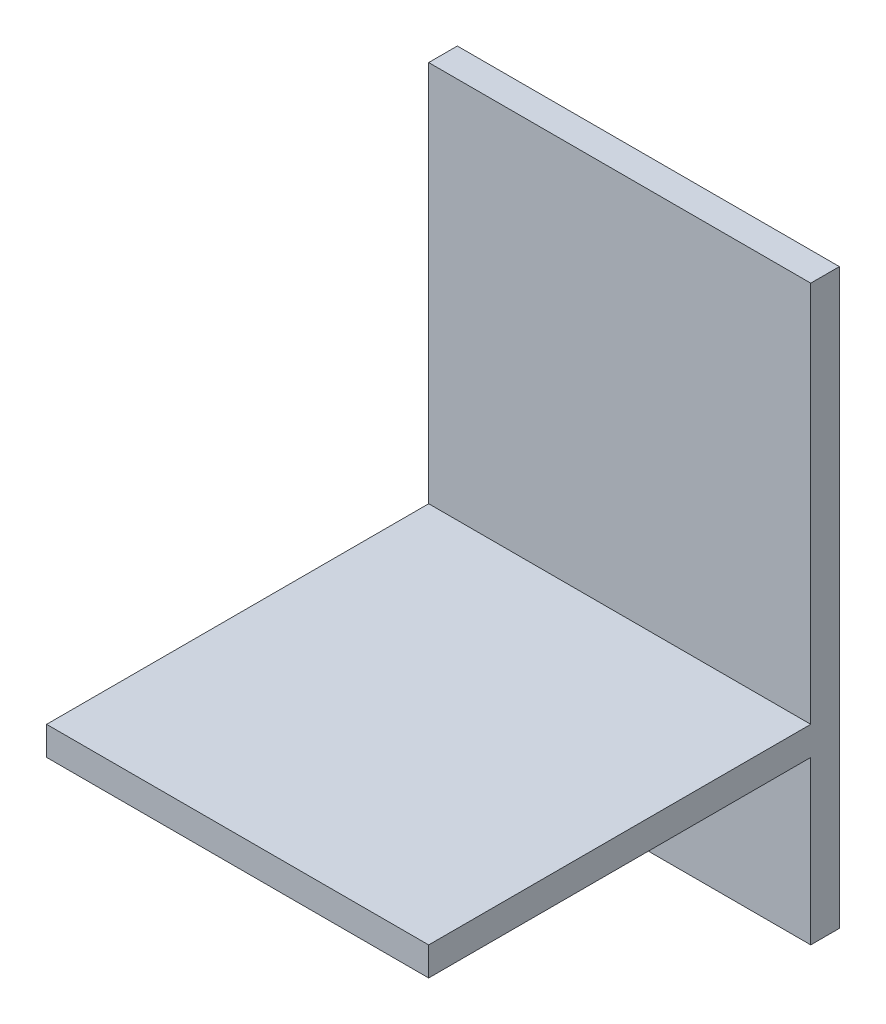
ISO-10303-21;
HEADER;
FILE_DESCRIPTION(('STEP AP214'),'2;1');
FILE_NAME('part.step','',(''),(''),'','','');
FILE_SCHEMA(('AUTOMOTIVE_DESIGN { 1 0 10303 214 1 1 1 1 }'));
ENDSEC;
DATA;
#1=APPLICATION_CONTEXT('core data for automotive mechanical design processes');
#2=APPLICATION_PROTOCOL_DEFINITION('international standard','automotive_design',2000,#1);
#3=PRODUCT_CONTEXT('',#1,'mechanical');
#4=PRODUCT('Part','Part','',(#3));
#5=PRODUCT_RELATED_PRODUCT_CATEGORY('part','',(#4));
#6=PRODUCT_DEFINITION_FORMATION('','',#4);
#7=PRODUCT_DEFINITION_CONTEXT('part definition',#1,'design');
#8=PRODUCT_DEFINITION('design','',#6,#7);
#9=PRODUCT_DEFINITION_SHAPE('','',#8);
#10=(LENGTH_UNIT() NAMED_UNIT(*) SI_UNIT(.MILLI.,.METRE.));
#11=(NAMED_UNIT(*) PLANE_ANGLE_UNIT() SI_UNIT($,.RADIAN.));
#12=(NAMED_UNIT(*) SI_UNIT($,.STERADIAN.) SOLID_ANGLE_UNIT());
#13=UNCERTAINTY_MEASURE_WITH_UNIT(LENGTH_MEASURE(1.E-05),#10,'distance_accuracy_value','');
#14=(GEOMETRIC_REPRESENTATION_CONTEXT(3) GLOBAL_UNCERTAINTY_ASSIGNED_CONTEXT((#13)) GLOBAL_UNIT_ASSIGNED_CONTEXT((#10,
#11,#12)) REPRESENTATION_CONTEXT('',''));
#15=CARTESIAN_POINT('',(0.,0.,0.));
#16=DIRECTION('',(0.,0.,1.));
#17=DIRECTION('',(1.,0.,0.));
#18=AXIS2_PLACEMENT_3D('',#15,#16,#17);
#19=CARTESIAN_POINT('',(0.,0.,3.));
#20=DIRECTION('',(0.,0.,1.));
#21=DIRECTION('',(1.,0.,0.));
#22=AXIS2_PLACEMENT_3D('',#19,#20,#21);
#23=PLANE('',#22);
#24=DIRECTION('',(-1.,0.,0.));
#25=VECTOR('',#24,1.);
#26=CARTESIAN_POINT('',(0.,-40.,3.));
#27=LINE('',#26,#25);
#28=CARTESIAN_POINT('',(40.,-40.,3.));
#29=VERTEX_POINT('',#28);
#30=CARTESIAN_POINT('',(0.,-40.,3.));
#31=VERTEX_POINT('',#30);
#32=EDGE_CURVE('E150',#29,#31,#27,.T.);
#33=ORIENTED_EDGE('',*,*,#32,.F.);
#34=DIRECTION('',(0.,1.,0.));
#35=VECTOR('',#34,1.);
#36=CARTESIAN_POINT('',(40.,0.,3.));
#37=LINE('',#36,#35);
#38=CARTESIAN_POINT('',(40.,0.,3.));
#39=VERTEX_POINT('',#38);
#40=EDGE_CURVE('E196',#29,#39,#37,.T.);
#41=ORIENTED_EDGE('',*,*,#40,.T.);
#42=DIRECTION('',(-1.,0.,0.));
#43=VECTOR('',#42,1.);
#44=CARTESIAN_POINT('',(0.,0.,3.));
#45=LINE('',#44,#43);
#46=CARTESIAN_POINT('',(0.,0.,3.));
#47=VERTEX_POINT('',#46);
#48=EDGE_CURVE('E201',#39,#47,#45,.T.);
#49=ORIENTED_EDGE('',*,*,#48,.T.);
#50=DIRECTION('',(0.,-1.,0.));
#51=VECTOR('',#50,1.);
#52=CARTESIAN_POINT('',(0.,0.,3.));
#53=LINE('',#52,#51);
#54=EDGE_CURVE('E189',#47,#31,#53,.T.);
#55=ORIENTED_EDGE('',*,*,#54,.T.);
#56=EDGE_LOOP('',(#33,#41,#49,#55));
#57=FACE_BOUND('',#56,.T.);
#58=ADVANCED_FACE('F39',(#57),#23,.T.);
#59=CARTESIAN_POINT('',(0.,0.,3.));
#60=DIRECTION('',(1.,0.,0.));
#61=DIRECTION('',(0.,1.,0.));
#62=AXIS2_PLACEMENT_3D('',#59,#60,#61);
#63=PLANE('',#62);
#64=CARTESIAN_POINT('',(0.,-43.,3.));
#65=VERTEX_POINT('',#64);
#66=CARTESIAN_POINT('',(0.,-60.,3.));
#67=VERTEX_POINT('',#66);
#68=EDGE_CURVE('E193',#65,#67,#53,.T.);
#69=ORIENTED_EDGE('',*,*,#68,.F.);
#70=DIRECTION('',(0.,0.,-1.));
#71=VECTOR('',#70,1.);
#72=CARTESIAN_POINT('',(0.,-43.,43.));
#73=LINE('',#72,#71);
#74=CARTESIAN_POINT('',(0.,-43.,43.));
#75=VERTEX_POINT('',#74);
#76=EDGE_CURVE('E185',#75,#65,#73,.T.);
#77=ORIENTED_EDGE('',*,*,#76,.F.);
#78=DIRECTION('',(0.,-1.,0.));
#79=VECTOR('',#78,1.);
#80=CARTESIAN_POINT('',(0.,-40.,43.));
#81=LINE('',#80,#79);
#82=CARTESIAN_POINT('',(0.,-40.,43.));
#83=VERTEX_POINT('',#82);
#84=EDGE_CURVE('E157',#83,#75,#81,.T.);
#85=ORIENTED_EDGE('',*,*,#84,.F.);
#86=DIRECTION('',(0.,0.,-1.));
#87=VECTOR('',#86,1.);
#88=CARTESIAN_POINT('',(0.,-40.,43.));
#89=LINE('',#88,#87);
#90=EDGE_CURVE('E169',#83,#31,#89,.T.);
#91=ORIENTED_EDGE('',*,*,#90,.T.);
#92=ORIENTED_EDGE('',*,*,#54,.F.);
#93=DIRECTION('',(0.,0.,-1.));
#94=VECTOR('',#93,1.);
#95=CARTESIAN_POINT('',(0.,0.,3.));
#96=LINE('',#95,#94);
#97=CARTESIAN_POINT('',(0.,0.,0.));
#98=VERTEX_POINT('',#97);
#99=EDGE_CURVE('E204',#47,#98,#96,.T.);
#100=ORIENTED_EDGE('',*,*,#99,.T.);
#101=DIRECTION('',(0.,-1.,0.));
#102=VECTOR('',#101,1.);
#103=CARTESIAN_POINT('',(0.,0.,0.));
#104=LINE('',#103,#102);
#105=CARTESIAN_POINT('',(0.,-60.,0.));
#106=VERTEX_POINT('',#105);
#107=EDGE_CURVE('E188',#98,#106,#104,.T.);
#108=ORIENTED_EDGE('',*,*,#107,.T.);
#109=DIRECTION('',(0.,0.,-1.));
#110=VECTOR('',#109,1.);
#111=CARTESIAN_POINT('',(0.,-60.,3.));
#112=LINE('',#111,#110);
#113=EDGE_CURVE('E11',#67,#106,#112,.T.);
#114=ORIENTED_EDGE('',*,*,#113,.F.);
#115=EDGE_LOOP('',(#69,#77,#85,#91,#92,#100,#108,#114));
#116=FACE_BOUND('',#115,.T.);
#117=ADVANCED_FACE('F41',(#116),#63,.F.);
#118=CARTESIAN_POINT('',(0.,-60.,3.));
#119=DIRECTION('',(0.,1.,0.));
#120=DIRECTION('',(0.,0.,1.));
#121=AXIS2_PLACEMENT_3D('',#118,#119,#120);
#122=PLANE('',#121);
#123=DIRECTION('',(1.,0.,0.));
#124=VECTOR('',#123,1.);
#125=CARTESIAN_POINT('',(0.,-60.,0.));
#126=LINE('',#125,#124);
#127=CARTESIAN_POINT('',(40.,-60.,0.));
#128=VERTEX_POINT('',#127);
#129=EDGE_CURVE('E208',#106,#128,#126,.T.);
#130=ORIENTED_EDGE('',*,*,#129,.T.);
#131=DIRECTION('',(0.,0.,-1.));
#132=VECTOR('',#131,1.);
#133=CARTESIAN_POINT('',(40.,-60.,3.));
#134=LINE('',#133,#132);
#135=CARTESIAN_POINT('',(40.,-60.,3.));
#136=VERTEX_POINT('',#135);
#137=EDGE_CURVE('E48',#136,#128,#134,.T.);
#138=ORIENTED_EDGE('',*,*,#137,.F.);
#139=DIRECTION('',(1.,0.,0.));
#140=VECTOR('',#139,1.);
#141=CARTESIAN_POINT('',(0.,-60.,3.));
#142=LINE('',#141,#140);
#143=EDGE_CURVE('E192',#67,#136,#142,.T.);
#144=ORIENTED_EDGE('',*,*,#143,.F.);
#145=ORIENTED_EDGE('',*,*,#113,.T.);
#146=EDGE_LOOP('',(#130,#138,#144,#145));
#147=FACE_BOUND('',#146,.T.);
#148=ADVANCED_FACE('F257',(#147),#122,.F.);
#149=CARTESIAN_POINT('',(40.,0.,3.));
#150=DIRECTION('',(-1.,0.,0.));
#151=DIRECTION('',(0.,-1.,0.));
#152=AXIS2_PLACEMENT_3D('',#149,#150,#151);
#153=PLANE('',#152);
#154=DIRECTION('',(0.,1.,0.));
#155=VECTOR('',#154,1.);
#156=CARTESIAN_POINT('',(40.,0.,0.));
#157=LINE('',#156,#155);
#158=CARTESIAN_POINT('',(40.,0.,0.));
#159=VERTEX_POINT('',#158);
#160=EDGE_CURVE('E211',#128,#159,#157,.T.);
#161=ORIENTED_EDGE('',*,*,#160,.T.);
#162=DIRECTION('',(0.,0.,-1.));
#163=VECTOR('',#162,1.);
#164=CARTESIAN_POINT('',(40.,0.,3.));
#165=LINE('',#164,#163);
#166=EDGE_CURVE('E220',#39,#159,#165,.T.);
#167=ORIENTED_EDGE('',*,*,#166,.F.);
#168=ORIENTED_EDGE('',*,*,#40,.F.);
#169=DIRECTION('',(0.,0.,-1.));
#170=VECTOR('',#169,1.);
#171=CARTESIAN_POINT('',(40.,-40.,43.));
#172=LINE('',#171,#170);
#173=CARTESIAN_POINT('',(40.,-40.,43.));
#174=VERTEX_POINT('',#173);
#175=EDGE_CURVE('E177',#174,#29,#172,.T.);
#176=ORIENTED_EDGE('',*,*,#175,.F.);
#177=DIRECTION('',(0.,1.,0.));
#178=VECTOR('',#177,1.);
#179=CARTESIAN_POINT('',(40.,-40.,43.));
#180=LINE('',#179,#178);
#181=CARTESIAN_POINT('',(40.,-43.,43.));
#182=VERTEX_POINT('',#181);
#183=EDGE_CURVE('E164',#182,#174,#180,.T.);
#184=ORIENTED_EDGE('',*,*,#183,.F.);
#185=DIRECTION('',(0.,0.,-1.));
#186=VECTOR('',#185,1.);
#187=CARTESIAN_POINT('',(40.,-43.,43.));
#188=LINE('',#187,#186);
#189=CARTESIAN_POINT('',(40.,-43.,3.));
#190=VERTEX_POINT('',#189);
#191=EDGE_CURVE('E181',#182,#190,#188,.T.);
#192=ORIENTED_EDGE('',*,*,#191,.T.);
#193=EDGE_CURVE('E197',#136,#190,#37,.T.);
#194=ORIENTED_EDGE('',*,*,#193,.F.);
#195=ORIENTED_EDGE('',*,*,#137,.T.);
#196=EDGE_LOOP('',(#161,#167,#168,#176,#184,#192,#194,#195));
#197=FACE_BOUND('',#196,.T.);
#198=ADVANCED_FACE('F229',(#197),#153,.F.);
#199=CARTESIAN_POINT('',(0.,0.,3.));
#200=DIRECTION('',(0.,-1.,0.));
#201=DIRECTION('',(0.,0.,-1.));
#202=AXIS2_PLACEMENT_3D('',#199,#200,#201);
#203=PLANE('',#202);
#204=DIRECTION('',(-1.,0.,0.));
#205=VECTOR('',#204,1.);
#206=CARTESIAN_POINT('',(0.,0.,0.));
#207=LINE('',#206,#205);
#208=EDGE_CURVE('E214',#159,#98,#207,.T.);
#209=ORIENTED_EDGE('',*,*,#208,.T.);
#210=ORIENTED_EDGE('',*,*,#99,.F.);
#211=ORIENTED_EDGE('',*,*,#48,.F.);
#212=ORIENTED_EDGE('',*,*,#166,.T.);
#213=EDGE_LOOP('',(#209,#210,#211,#212));
#214=FACE_BOUND('',#213,.T.);
#215=ADVANCED_FACE('F239',(#214),#203,.F.);
#216=DIRECTION('',(-1.,0.,0.));
#217=VECTOR('',#216,1.);
#218=CARTESIAN_POINT('',(23.,-55.,3.));
#219=LINE('',#218,#217);
#220=CARTESIAN_POINT('',(23.,-55.,3.));
#221=VERTEX_POINT('',#220);
#222=CARTESIAN_POINT('',(17.,-55.,3.));
#223=VERTEX_POINT('',#222);
#224=EDGE_CURVE('E146',#221,#223,#219,.T.);
#225=ORIENTED_EDGE('',*,*,#224,.T.);
#226=DIRECTION('',(0.,-1.,0.));
#227=VECTOR('',#226,1.);
#228=CARTESIAN_POINT('',(17.,-43.,3.));
#229=LINE('',#228,#227);
#230=CARTESIAN_POINT('',(17.,-43.,3.));
#231=VERTEX_POINT('',#230);
#232=EDGE_CURVE('E55',#231,#223,#229,.T.);
#233=ORIENTED_EDGE('',*,*,#232,.F.);
#234=DIRECTION('',(-1.,0.,0.));
#235=VECTOR('',#234,1.);
#236=CARTESIAN_POINT('',(17.,-43.,3.));
#237=LINE('',#236,#235);
#238=EDGE_CURVE('E137',#231,#65,#237,.T.);
#239=ORIENTED_EDGE('',*,*,#238,.T.);
#240=ORIENTED_EDGE('',*,*,#68,.T.);
#241=ORIENTED_EDGE('',*,*,#143,.T.);
#242=ORIENTED_EDGE('',*,*,#193,.T.);
#243=DIRECTION('',(1.,0.,0.));
#244=VECTOR('',#243,1.);
#245=CARTESIAN_POINT('',(0.,-43.,3.));
#246=LINE('',#245,#244);
#247=CARTESIAN_POINT('',(23.,-43.,3.));
#248=VERTEX_POINT('',#247);
#249=EDGE_CURVE('E145',#248,#190,#246,.T.);
#250=ORIENTED_EDGE('',*,*,#249,.F.);
#251=DIRECTION('',(0.,-1.,0.));
#252=VECTOR('',#251,1.);
#253=CARTESIAN_POINT('',(23.,-43.,3.));
#254=LINE('',#253,#252);
#255=EDGE_CURVE('E63',#248,#221,#254,.T.);
#256=ORIENTED_EDGE('',*,*,#255,.T.);
#257=EDGE_LOOP('',(#225,#233,#239,#240,#241,#242,#250,#256));
#258=FACE_BOUND('',#257,.T.);
#259=ADVANCED_FACE('F255',(#258),#23,.T.);
#260=CARTESIAN_POINT('',(0.,0.,0.));
#261=DIRECTION('',(0.,0.,1.));
#262=DIRECTION('',(1.,0.,0.));
#263=AXIS2_PLACEMENT_3D('',#260,#261,#262);
#264=PLANE('',#263);
#265=ORIENTED_EDGE('',*,*,#107,.F.);
#266=ORIENTED_EDGE('',*,*,#208,.F.);
#267=ORIENTED_EDGE('',*,*,#160,.F.);
#268=ORIENTED_EDGE('',*,*,#129,.F.);
#269=EDGE_LOOP('',(#265,#266,#267,#268));
#270=FACE_BOUND('',#269,.T.);
#271=ADVANCED_FACE('F236',(#270),#264,.F.);
#272=CARTESIAN_POINT('',(0.,-43.,43.));
#273=DIRECTION('',(0.,1.,0.));
#274=DIRECTION('',(0.,0.,1.));
#275=AXIS2_PLACEMENT_3D('',#272,#273,#274);
#276=PLANE('',#275);
#277=ORIENTED_EDGE('',*,*,#76,.T.);
#278=ORIENTED_EDGE('',*,*,#238,.F.);
#279=DIRECTION('',(0.,0.,-1.));
#280=VECTOR('',#279,1.);
#281=CARTESIAN_POINT('',(17.,-43.,28.));
#282=LINE('',#281,#280);
#283=CARTESIAN_POINT('',(17.,-43.,28.));
#284=VERTEX_POINT('',#283);
#285=EDGE_CURVE('E126',#284,#231,#282,.T.);
#286=ORIENTED_EDGE('',*,*,#285,.F.);
#287=DIRECTION('',(-1.,0.,0.));
#288=VECTOR('',#287,1.);
#289=CARTESIAN_POINT('',(23.,-43.,28.));
#290=LINE('',#289,#288);
#291=CARTESIAN_POINT('',(23.,-43.,28.));
#292=VERTEX_POINT('',#291);
#293=EDGE_CURVE('E134',#292,#284,#290,.T.);
#294=ORIENTED_EDGE('',*,*,#293,.F.);
#295=DIRECTION('',(0.,0.,-1.));
#296=VECTOR('',#295,1.);
#297=CARTESIAN_POINT('',(23.,-43.,28.));
#298=LINE('',#297,#296);
#299=EDGE_CURVE('E152',#292,#248,#298,.T.);
#300=ORIENTED_EDGE('',*,*,#299,.T.);
#301=ORIENTED_EDGE('',*,*,#249,.T.);
#302=ORIENTED_EDGE('',*,*,#191,.F.);
#303=DIRECTION('',(1.,0.,0.));
#304=VECTOR('',#303,1.);
#305=CARTESIAN_POINT('',(0.,-43.,43.));
#306=LINE('',#305,#304);
#307=EDGE_CURVE('E161',#75,#182,#306,.T.);
#308=ORIENTED_EDGE('',*,*,#307,.F.);
#309=EDGE_LOOP('',(#277,#278,#286,#294,#300,#301,#302,#308));
#310=FACE_BOUND('',#309,.T.);
#311=ADVANCED_FACE('F133',(#310),#276,.F.);
#312=CARTESIAN_POINT('',(0.,-40.,43.));
#313=DIRECTION('',(0.,-1.,0.));
#314=DIRECTION('',(0.,0.,-1.));
#315=AXIS2_PLACEMENT_3D('',#312,#313,#314);
#316=PLANE('',#315);
#317=ORIENTED_EDGE('',*,*,#32,.T.);
#318=ORIENTED_EDGE('',*,*,#90,.F.);
#319=DIRECTION('',(-1.,0.,0.));
#320=VECTOR('',#319,1.);
#321=CARTESIAN_POINT('',(0.,-40.,43.));
#322=LINE('',#321,#320);
#323=EDGE_CURVE('E167',#174,#83,#322,.T.);
#324=ORIENTED_EDGE('',*,*,#323,.F.);
#325=ORIENTED_EDGE('',*,*,#175,.T.);
#326=EDGE_LOOP('',(#317,#318,#324,#325));
#327=FACE_BOUND('',#326,.T.);
#328=ADVANCED_FACE('F249',(#327),#316,.F.);
#329=CARTESIAN_POINT('',(0.,0.,43.));
#330=DIRECTION('',(0.,0.,1.));
#331=DIRECTION('',(1.,0.,0.));
#332=AXIS2_PLACEMENT_3D('',#329,#330,#331);
#333=PLANE('',#332);
#334=ORIENTED_EDGE('',*,*,#84,.T.);
#335=ORIENTED_EDGE('',*,*,#307,.T.);
#336=ORIENTED_EDGE('',*,*,#183,.T.);
#337=ORIENTED_EDGE('',*,*,#323,.T.);
#338=EDGE_LOOP('',(#334,#335,#336,#337));
#339=FACE_BOUND('',#338,.T.);
#340=ADVANCED_FACE('F297',(#339),#333,.T.);
#341=CARTESIAN_POINT('',(23.,-55.,3.));
#342=DIRECTION('',(0.,-0.901523057468274,0.432731067584771));
#343=DIRECTION('',(0.,-0.432731067584771,-0.901523057468274));
#344=AXIS2_PLACEMENT_3D('',#341,#342,#343);
#345=PLANE('',#344);
#346=DIRECTION('',(0.,0.432731067584771,0.901523057468274));
#347=VECTOR('',#346,1.);
#348=CARTESIAN_POINT('',(17.,-55.,3.));
#349=LINE('',#348,#347);
#350=EDGE_CURVE('E123',#223,#284,#349,.T.);
#351=ORIENTED_EDGE('',*,*,#350,.F.);
#352=ORIENTED_EDGE('',*,*,#224,.F.);
#353=DIRECTION('',(0.,0.432731067584771,0.901523057468274));
#354=VECTOR('',#353,1.);
#355=CARTESIAN_POINT('',(23.,-55.,3.));
#356=LINE('',#355,#354);
#357=EDGE_CURVE('E142',#221,#292,#356,.T.);
#358=ORIENTED_EDGE('',*,*,#357,.T.);
#359=ORIENTED_EDGE('',*,*,#293,.T.);
#360=EDGE_LOOP('',(#351,#352,#358,#359));
#361=FACE_BOUND('',#360,.T.);
#362=ADVANCED_FACE('F140',(#361),#345,.T.);
#363=CARTESIAN_POINT('',(23.,0.,0.));
#364=DIRECTION('',(1.,0.,0.));
#365=DIRECTION('',(0.,1.,0.));
#366=AXIS2_PLACEMENT_3D('',#363,#364,#365);
#367=PLANE('',#366);
#368=ORIENTED_EDGE('',*,*,#255,.F.);
#369=ORIENTED_EDGE('',*,*,#299,.F.);
#370=ORIENTED_EDGE('',*,*,#357,.F.);
#371=EDGE_LOOP('',(#368,#369,#370));
#372=FACE_BOUND('',#371,.T.);
#373=ADVANCED_FACE('F314',(#372),#367,.T.);
#374=CARTESIAN_POINT('',(17.,0.,0.));
#375=DIRECTION('',(1.,0.,0.));
#376=DIRECTION('',(0.,1.,0.));
#377=AXIS2_PLACEMENT_3D('',#374,#375,#376);
#378=PLANE('',#377);
#379=ORIENTED_EDGE('',*,*,#232,.T.);
#380=ORIENTED_EDGE('',*,*,#350,.T.);
#381=ORIENTED_EDGE('',*,*,#285,.T.);
#382=EDGE_LOOP('',(#379,#380,#381));
#383=FACE_BOUND('',#382,.T.);
#384=ADVANCED_FACE('F125',(#383),#378,.F.);
#385=CLOSED_SHELL('',(#58,#117,#148,#198,#215,#259,#271,#311,#328,#340,#362,#373,#384));
#386=MANIFOLD_SOLID_BREP('B2',#385);
#387=ADVANCED_BREP_SHAPE_REPRESENTATION('',(#18,#386),#14);
#388=SHAPE_DEFINITION_REPRESENTATION(#9,#387);
ENDSEC;
END-ISO-10303-21;
